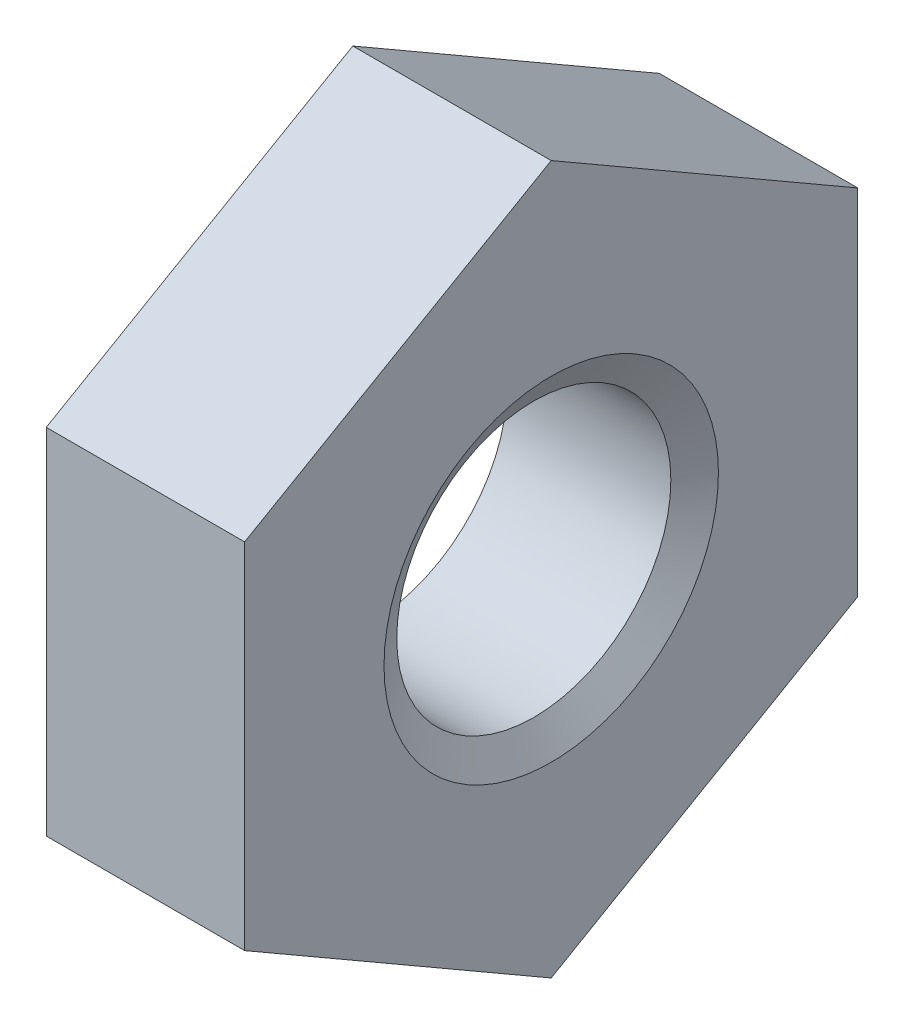
ISO-10303-21;
HEADER;
FILE_DESCRIPTION(('STEP AP214'),'2;1');
FILE_NAME('part.step','',(''),(''),'','','');
FILE_SCHEMA(('AUTOMOTIVE_DESIGN { 1 0 10303 214 1 1 1 1 }'));
ENDSEC;
DATA;
#1=APPLICATION_CONTEXT('core data for automotive mechanical design processes');
#2=APPLICATION_PROTOCOL_DEFINITION('international standard','automotive_design',2000,#1);
#3=PRODUCT_CONTEXT('',#1,'mechanical');
#4=PRODUCT('Part','Part','',(#3));
#5=PRODUCT_RELATED_PRODUCT_CATEGORY('part','',(#4));
#6=PRODUCT_DEFINITION_FORMATION('','',#4);
#7=PRODUCT_DEFINITION_CONTEXT('part definition',#1,'design');
#8=PRODUCT_DEFINITION('design','',#6,#7);
#9=PRODUCT_DEFINITION_SHAPE('','',#8);
#10=(LENGTH_UNIT() NAMED_UNIT(*) SI_UNIT(.MILLI.,.METRE.));
#11=(NAMED_UNIT(*) PLANE_ANGLE_UNIT() SI_UNIT($,.RADIAN.));
#12=(NAMED_UNIT(*) SI_UNIT($,.STERADIAN.) SOLID_ANGLE_UNIT());
#13=UNCERTAINTY_MEASURE_WITH_UNIT(LENGTH_MEASURE(1.E-05),#10,'distance_accuracy_value','');
#14=(GEOMETRIC_REPRESENTATION_CONTEXT(3) GLOBAL_UNCERTAINTY_ASSIGNED_CONTEXT((#13)) GLOBAL_UNIT_ASSIGNED_CONTEXT((#10,
#11,#12)) REPRESENTATION_CONTEXT('',''));
#15=CARTESIAN_POINT('',(0.,0.,0.));
#16=DIRECTION('',(0.,0.,1.));
#17=DIRECTION('',(1.,0.,0.));
#18=AXIS2_PLACEMENT_3D('',#15,#16,#17);
#19=CARTESIAN_POINT('',(0.078125,0.,0.));
#20=DIRECTION('',(-1.,0.,0.));
#21=DIRECTION('',(0.,0.,-1.));
#22=AXIS2_PLACEMENT_3D('',#19,#20,#21);
#23=CONICAL_SURFACE('',#22,1.36481646934132,1.0471975511966);
#24=CARTESIAN_POINT('',(0.15625,0.,0.));
#25=DIRECTION('',(1.,0.,0.));
#26=DIRECTION('',(0.,0.,-1.));
#27=AXIS2_PLACEMENT_3D('',#24,#25,#26);
#28=CIRCLE('',#27,1.2295);
#29=CARTESIAN_POINT('',(0.15625,0.,1.2295));
#30=VERTEX_POINT('',#29);
#31=EDGE_CURVE('E11',#30,#30,#28,.T.);
#32=ORIENTED_EDGE('',*,*,#31,.T.);
#33=EDGE_LOOP('',(#32));
#34=FACE_BOUND('',#33,.T.);
#35=CARTESIAN_POINT('',(0.,0.,0.));
#36=DIRECTION('',(-1.,0.,0.));
#37=DIRECTION('',(0.,0.,-1.));
#38=AXIS2_PLACEMENT_3D('',#35,#36,#37);
#39=CIRCLE('',#38,1.50013293868264);
#40=CARTESIAN_POINT('',(0.,0.,1.50013293868264));
#41=VERTEX_POINT('',#40);
#42=EDGE_CURVE('E27',#41,#41,#39,.T.);
#43=ORIENTED_EDGE('',*,*,#42,.T.);
#44=EDGE_LOOP('',(#43));
#45=FACE_BOUND('',#44,.T.);
#46=ADVANCED_FACE('F17',(#34,#45),#23,.F.);
#47=CARTESIAN_POINT('',(-6.80788293663423,0.,0.));
#48=DIRECTION('',(1.,0.,0.));
#49=DIRECTION('',(0.,0.,-1.));
#50=AXIS2_PLACEMENT_3D('',#47,#48,#49);
#51=CYLINDRICAL_SURFACE('',#50,1.2295);
#52=CARTESIAN_POINT('',(1.62375,0.,0.));
#53=DIRECTION('',(-1.,0.,0.));
#54=DIRECTION('',(0.,0.,1.));
#55=AXIS2_PLACEMENT_3D('',#52,#53,#54);
#56=CIRCLE('',#55,1.2295);
#57=CARTESIAN_POINT('',(1.62375,0.,-1.2295));
#58=VERTEX_POINT('',#57);
#59=EDGE_CURVE('E127',#58,#58,#56,.T.);
#60=ORIENTED_EDGE('',*,*,#59,.F.);
#61=EDGE_LOOP('',(#60));
#62=FACE_BOUND('',#61,.T.);
#63=ORIENTED_EDGE('',*,*,#31,.F.);
#64=EDGE_LOOP('',(#63));
#65=FACE_BOUND('',#64,.T.);
#66=ADVANCED_FACE('F150',(#62,#65),#51,.F.);
#67=CARTESIAN_POINT('',(0.,0.,0.));
#68=DIRECTION('',(1.,0.,0.));
#69=DIRECTION('',(0.,0.707106781186548,0.707106781186548));
#70=AXIS2_PLACEMENT_3D('',#67,#68,#69);
#71=PLANE('',#70);
#72=DIRECTION('',(0.,-1.,0.));
#73=VECTOR('',#72,1.);
#74=CARTESIAN_POINT('',(0.,1.58771324027147,-2.75));
#75=LINE('',#74,#73);
#76=CARTESIAN_POINT('',(0.,1.58771324027147,-2.75));
#77=VERTEX_POINT('',#76);
#78=CARTESIAN_POINT('',(0.,-1.58771324027147,-2.75));
#79=VERTEX_POINT('',#78);
#80=EDGE_CURVE('E139',#77,#79,#75,.T.);
#81=ORIENTED_EDGE('',*,*,#80,.T.);
#82=DIRECTION('',(0.,-0.5,0.866025403784439));
#83=VECTOR('',#82,1.);
#84=CARTESIAN_POINT('',(0.,-1.58771324027147,-2.75));
#85=LINE('',#84,#83);
#86=CARTESIAN_POINT('',(0.,-3.17542648054294,0.));
#87=VERTEX_POINT('',#86);
#88=EDGE_CURVE('E136',#79,#87,#85,.T.);
#89=ORIENTED_EDGE('',*,*,#88,.T.);
#90=DIRECTION('',(0.,0.5,0.866025403784438));
#91=VECTOR('',#90,1.);
#92=CARTESIAN_POINT('',(0.,-3.17542648054294,0.));
#93=LINE('',#92,#91);
#94=CARTESIAN_POINT('',(0.,-1.58771324027146,2.75));
#95=VERTEX_POINT('',#94);
#96=EDGE_CURVE('E134',#87,#95,#93,.T.);
#97=ORIENTED_EDGE('',*,*,#96,.T.);
#98=DIRECTION('',(0.,1.,0.));
#99=VECTOR('',#98,1.);
#100=CARTESIAN_POINT('',(0.,-1.58771324027146,2.75));
#101=LINE('',#100,#99);
#102=CARTESIAN_POINT('',(0.,1.58771324027148,2.75));
#103=VERTEX_POINT('',#102);
#104=EDGE_CURVE('E101',#95,#103,#101,.T.);
#105=ORIENTED_EDGE('',*,*,#104,.T.);
#106=DIRECTION('',(0.,0.5,-0.866025403784441));
#107=VECTOR('',#106,1.);
#108=CARTESIAN_POINT('',(0.,1.58771324027148,2.75));
#109=LINE('',#108,#107);
#110=CARTESIAN_POINT('',(0.,3.17542648054294,0.));
#111=VERTEX_POINT('',#110);
#112=EDGE_CURVE('E130',#103,#111,#109,.T.);
#113=ORIENTED_EDGE('',*,*,#112,.T.);
#114=DIRECTION('',(0.,-0.5,-0.866025403784438));
#115=VECTOR('',#114,1.);
#116=CARTESIAN_POINT('',(0.,3.17542648054294,0.));
#117=LINE('',#116,#115);
#118=EDGE_CURVE('E128',#111,#77,#117,.T.);
#119=ORIENTED_EDGE('',*,*,#118,.T.);
#120=EDGE_LOOP('',(#81,#89,#97,#105,#113,#119));
#121=FACE_BOUND('',#120,.T.);
#122=ORIENTED_EDGE('',*,*,#42,.F.);
#123=EDGE_LOOP('',(#122));
#124=FACE_BOUND('',#123,.T.);
#125=ADVANCED_FACE('F147',(#121,#124),#71,.F.);
#126=CARTESIAN_POINT('',(1.701875,0.,0.));
#127=DIRECTION('',(1.,0.,0.));
#128=DIRECTION('',(0.,0.,1.));
#129=AXIS2_PLACEMENT_3D('',#126,#127,#128);
#130=CONICAL_SURFACE('',#129,1.36481646934132,1.0471975511966);
#131=ORIENTED_EDGE('',*,*,#59,.T.);
#132=EDGE_LOOP('',(#131));
#133=FACE_BOUND('',#132,.T.);
#134=CARTESIAN_POINT('',(1.78,0.,0.));
#135=DIRECTION('',(1.,0.,0.));
#136=DIRECTION('',(0.,0.,1.));
#137=AXIS2_PLACEMENT_3D('',#134,#135,#136);
#138=CIRCLE('',#137,1.50013293868264);
#139=CARTESIAN_POINT('',(1.78,0.,-1.50013293868264));
#140=VERTEX_POINT('',#139);
#141=EDGE_CURVE('E124',#140,#140,#138,.T.);
#142=ORIENTED_EDGE('',*,*,#141,.T.);
#143=EDGE_LOOP('',(#142));
#144=FACE_BOUND('',#143,.T.);
#145=ADVANCED_FACE('F149',(#133,#144),#130,.F.);
#146=CARTESIAN_POINT('',(1.78,0.,0.));
#147=DIRECTION('',(1.,0.,0.));
#148=DIRECTION('',(0.,0.707106781186548,0.707106781186548));
#149=AXIS2_PLACEMENT_3D('',#146,#147,#148);
#150=PLANE('',#149);
#151=DIRECTION('',(0.,-0.5,0.866025403784439));
#152=VECTOR('',#151,1.);
#153=CARTESIAN_POINT('',(1.78,-1.58771324027147,-2.75));
#154=LINE('',#153,#152);
#155=CARTESIAN_POINT('',(1.78,-1.58771324027147,-2.75));
#156=VERTEX_POINT('',#155);
#157=CARTESIAN_POINT('',(1.78,-3.17542648054294,0.));
#158=VERTEX_POINT('',#157);
#159=EDGE_CURVE('E122',#156,#158,#154,.T.);
#160=ORIENTED_EDGE('',*,*,#159,.F.);
#161=DIRECTION('',(0.,-1.,0.));
#162=VECTOR('',#161,1.);
#163=CARTESIAN_POINT('',(1.78,1.58771324027147,-2.75));
#164=LINE('',#163,#162);
#165=CARTESIAN_POINT('',(1.78,1.58771324027147,-2.75));
#166=VERTEX_POINT('',#165);
#167=EDGE_CURVE('E112',#166,#156,#164,.T.);
#168=ORIENTED_EDGE('',*,*,#167,.F.);
#169=DIRECTION('',(0.,-0.5,-0.866025403784438));
#170=VECTOR('',#169,1.);
#171=CARTESIAN_POINT('',(1.78,3.17542648054294,0.));
#172=LINE('',#171,#170);
#173=CARTESIAN_POINT('',(1.78,3.17542648054294,0.));
#174=VERTEX_POINT('',#173);
#175=EDGE_CURVE('E109',#174,#166,#172,.T.);
#176=ORIENTED_EDGE('',*,*,#175,.F.);
#177=DIRECTION('',(0.,0.5,-0.866025403784441));
#178=VECTOR('',#177,1.);
#179=CARTESIAN_POINT('',(1.78,1.58771324027148,2.75));
#180=LINE('',#179,#178);
#181=CARTESIAN_POINT('',(1.78,1.58771324027148,2.75));
#182=VERTEX_POINT('',#181);
#183=EDGE_CURVE('E76',#182,#174,#180,.T.);
#184=ORIENTED_EDGE('',*,*,#183,.F.);
#185=DIRECTION('',(0.,1.,0.));
#186=VECTOR('',#185,1.);
#187=CARTESIAN_POINT('',(1.78,-1.58771324027146,2.75));
#188=LINE('',#187,#186);
#189=CARTESIAN_POINT('',(1.78,-1.58771324027146,2.75));
#190=VERTEX_POINT('',#189);
#191=EDGE_CURVE('E78',#190,#182,#188,.T.);
#192=ORIENTED_EDGE('',*,*,#191,.F.);
#193=DIRECTION('',(0.,0.5,0.866025403784438));
#194=VECTOR('',#193,1.);
#195=CARTESIAN_POINT('',(1.78,-3.17542648054294,0.));
#196=LINE('',#195,#194);
#197=EDGE_CURVE('E83',#158,#190,#196,.T.);
#198=ORIENTED_EDGE('',*,*,#197,.F.);
#199=EDGE_LOOP('',(#160,#168,#176,#184,#192,#198));
#200=FACE_BOUND('',#199,.T.);
#201=ORIENTED_EDGE('',*,*,#141,.F.);
#202=EDGE_LOOP('',(#201));
#203=FACE_BOUND('',#202,.T.);
#204=ADVANCED_FACE('F81',(#200,#203),#150,.T.);
#205=CARTESIAN_POINT('',(0.,-1.58771324027147,-2.75));
#206=DIRECTION('',(0.,-0.866025403784439,-0.5));
#207=DIRECTION('',(0.654653670707977,-0.377964473009227,0.654653670707977));
#208=AXIS2_PLACEMENT_3D('',#205,#206,#207);
#209=PLANE('',#208);
#210=ORIENTED_EDGE('',*,*,#159,.T.);
#211=DIRECTION('',(1.,0.,0.));
#212=VECTOR('',#211,1.);
#213=CARTESIAN_POINT('',(0.,-3.17542648054294,0.));
#214=LINE('',#213,#212);
#215=EDGE_CURVE('E89',#87,#158,#214,.T.);
#216=ORIENTED_EDGE('',*,*,#215,.F.);
#217=ORIENTED_EDGE('',*,*,#88,.F.);
#218=DIRECTION('',(1.,0.,0.));
#219=VECTOR('',#218,1.);
#220=CARTESIAN_POINT('',(0.,-1.58771324027147,-2.75));
#221=LINE('',#220,#219);
#222=EDGE_CURVE('E97',#79,#156,#221,.T.);
#223=ORIENTED_EDGE('',*,*,#222,.T.);
#224=EDGE_LOOP('',(#210,#216,#217,#223));
#225=FACE_BOUND('',#224,.T.);
#226=ADVANCED_FACE('F201',(#225),#209,.T.);
#227=CARTESIAN_POINT('',(0.,-3.17542648054294,0.));
#228=DIRECTION('',(0.,-0.866025403784438,0.5));
#229=DIRECTION('',(0.654653670707977,0.377964473009229,0.654653670707977));
#230=AXIS2_PLACEMENT_3D('',#227,#228,#229);
#231=PLANE('',#230);
#232=ORIENTED_EDGE('',*,*,#197,.T.);
#233=DIRECTION('',(1.,0.,0.));
#234=VECTOR('',#233,1.);
#235=CARTESIAN_POINT('',(0.,-1.58771324027146,2.75));
#236=LINE('',#235,#234);
#237=EDGE_CURVE('E90',#95,#190,#236,.T.);
#238=ORIENTED_EDGE('',*,*,#237,.F.);
#239=ORIENTED_EDGE('',*,*,#96,.F.);
#240=ORIENTED_EDGE('',*,*,#215,.T.);
#241=EDGE_LOOP('',(#232,#238,#239,#240));
#242=FACE_BOUND('',#241,.T.);
#243=ADVANCED_FACE('F95',(#242),#231,.T.);
#244=CARTESIAN_POINT('',(0.,-1.58771324027146,2.75));
#245=DIRECTION('',(0.,0.,1.));
#246=DIRECTION('',(0.707106781186548,0.707106781186548,0.));
#247=AXIS2_PLACEMENT_3D('',#244,#245,#246);
#248=PLANE('',#247);
#249=ORIENTED_EDGE('',*,*,#191,.T.);
#250=DIRECTION('',(1.,0.,0.));
#251=VECTOR('',#250,1.);
#252=CARTESIAN_POINT('',(0.,1.58771324027148,2.75));
#253=LINE('',#252,#251);
#254=EDGE_CURVE('E104',#103,#182,#253,.T.);
#255=ORIENTED_EDGE('',*,*,#254,.F.);
#256=ORIENTED_EDGE('',*,*,#104,.F.);
#257=ORIENTED_EDGE('',*,*,#237,.T.);
#258=EDGE_LOOP('',(#249,#255,#256,#257));
#259=FACE_BOUND('',#258,.T.);
#260=ADVANCED_FACE('F99',(#259),#248,.T.);
#261=CARTESIAN_POINT('',(0.,1.58771324027148,2.75));
#262=DIRECTION('',(0.,0.866025403784441,0.5));
#263=DIRECTION('',(0.654653670707978,-0.377964473009224,0.654653670707978));
#264=AXIS2_PLACEMENT_3D('',#261,#262,#263);
#265=PLANE('',#264);
#266=ORIENTED_EDGE('',*,*,#183,.T.);
#267=DIRECTION('',(1.,0.,0.));
#268=VECTOR('',#267,1.);
#269=CARTESIAN_POINT('',(0.,3.17542648054294,0.));
#270=LINE('',#269,#268);
#271=EDGE_CURVE('E110',#111,#174,#270,.T.);
#272=ORIENTED_EDGE('',*,*,#271,.F.);
#273=ORIENTED_EDGE('',*,*,#112,.F.);
#274=ORIENTED_EDGE('',*,*,#254,.T.);
#275=EDGE_LOOP('',(#266,#272,#273,#274));
#276=FACE_BOUND('',#275,.T.);
#277=ADVANCED_FACE('F230',(#276),#265,.T.);
#278=CARTESIAN_POINT('',(0.,3.17542648054294,0.));
#279=DIRECTION('',(0.,0.866025403784438,-0.5));
#280=DIRECTION('',(0.654653670707977,0.377964473009229,0.654653670707977));
#281=AXIS2_PLACEMENT_3D('',#278,#279,#280);
#282=PLANE('',#281);
#283=ORIENTED_EDGE('',*,*,#175,.T.);
#284=DIRECTION('',(1.,0.,0.));
#285=VECTOR('',#284,1.);
#286=CARTESIAN_POINT('',(0.,1.58771324027147,-2.75));
#287=LINE('',#286,#285);
#288=EDGE_CURVE('E21',#77,#166,#287,.T.);
#289=ORIENTED_EDGE('',*,*,#288,.F.);
#290=ORIENTED_EDGE('',*,*,#118,.F.);
#291=ORIENTED_EDGE('',*,*,#271,.T.);
#292=EDGE_LOOP('',(#283,#289,#290,#291));
#293=FACE_BOUND('',#292,.T.);
#294=ADVANCED_FACE('F240',(#293),#282,.T.);
#295=CARTESIAN_POINT('',(0.,1.58771324027147,-2.75));
#296=DIRECTION('',(0.,0.,-1.));
#297=DIRECTION('',(0.707106781186548,0.707106781186548,0.));
#298=AXIS2_PLACEMENT_3D('',#295,#296,#297);
#299=PLANE('',#298);
#300=ORIENTED_EDGE('',*,*,#167,.T.);
#301=ORIENTED_EDGE('',*,*,#222,.F.);
#302=ORIENTED_EDGE('',*,*,#80,.F.);
#303=ORIENTED_EDGE('',*,*,#288,.T.);
#304=EDGE_LOOP('',(#300,#301,#302,#303));
#305=FACE_BOUND('',#304,.T.);
#306=ADVANCED_FACE('F19',(#305),#299,.T.);
#307=CLOSED_SHELL('',(#46,#66,#125,#145,#204,#226,#243,#260,#277,#294,#306));
#308=MANIFOLD_SOLID_BREP('B1',#307);
#309=ADVANCED_BREP_SHAPE_REPRESENTATION('',(#18,#308),#14);
#310=SHAPE_DEFINITION_REPRESENTATION(#9,#309);
ENDSEC;
END-ISO-10303-21;
